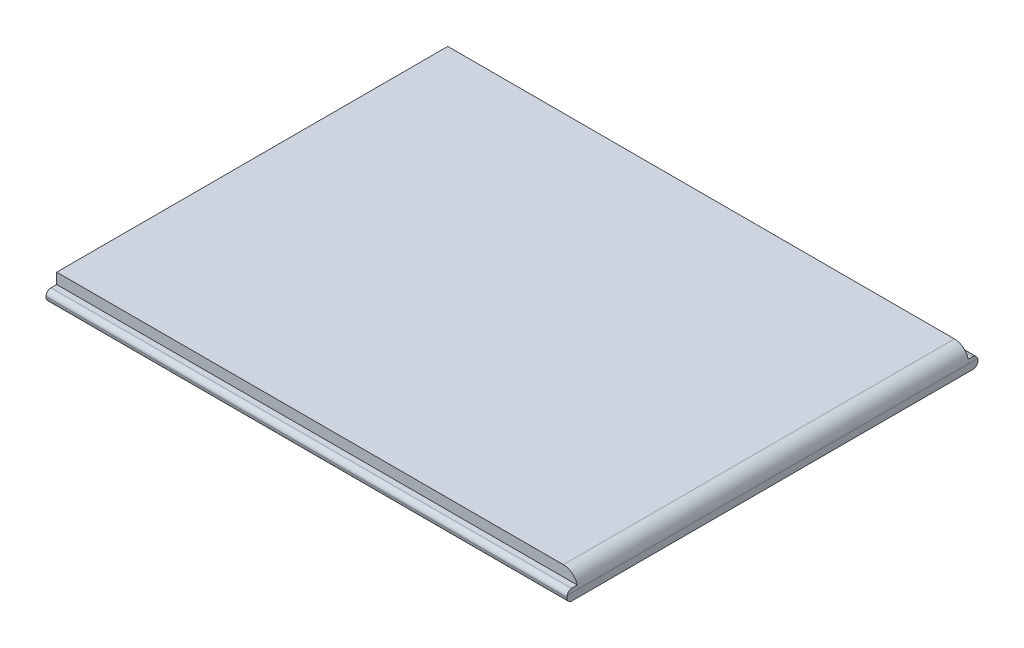
ISO-10303-21;
HEADER;
FILE_DESCRIPTION(('STEP AP214'),'2;1');
FILE_NAME('part.step','',(''),(''),'','','');
FILE_SCHEMA(('AUTOMOTIVE_DESIGN { 1 0 10303 214 1 1 1 1 }'));
ENDSEC;
DATA;
#1=APPLICATION_CONTEXT('core data for automotive mechanical design processes');
#2=APPLICATION_PROTOCOL_DEFINITION('international standard','automotive_design',2000,#1);
#3=PRODUCT_CONTEXT('',#1,'mechanical');
#4=PRODUCT('Part','Part','',(#3));
#5=PRODUCT_RELATED_PRODUCT_CATEGORY('part','',(#4));
#6=PRODUCT_DEFINITION_FORMATION('','',#4);
#7=PRODUCT_DEFINITION_CONTEXT('part definition',#1,'design');
#8=PRODUCT_DEFINITION('design','',#6,#7);
#9=PRODUCT_DEFINITION_SHAPE('','',#8);
#10=(LENGTH_UNIT() NAMED_UNIT(*) SI_UNIT(.MILLI.,.METRE.));
#11=(NAMED_UNIT(*) PLANE_ANGLE_UNIT() SI_UNIT($,.RADIAN.));
#12=(NAMED_UNIT(*) SI_UNIT($,.STERADIAN.) SOLID_ANGLE_UNIT());
#13=UNCERTAINTY_MEASURE_WITH_UNIT(LENGTH_MEASURE(1.E-05),#10,'distance_accuracy_value','');
#14=(GEOMETRIC_REPRESENTATION_CONTEXT(3) GLOBAL_UNCERTAINTY_ASSIGNED_CONTEXT((#13)) GLOBAL_UNIT_ASSIGNED_CONTEXT((#10,
#11,#12)) REPRESENTATION_CONTEXT('',''));
#15=CARTESIAN_POINT('',(0.,0.,0.));
#16=DIRECTION('',(0.,0.,1.));
#17=DIRECTION('',(1.,0.,0.));
#18=AXIS2_PLACEMENT_3D('',#15,#16,#17);
#19=CARTESIAN_POINT('',(0.,1.5,0.));
#20=DIRECTION('',(0.,-1.,0.));
#21=DIRECTION('',(0.,0.,-1.));
#22=AXIS2_PLACEMENT_3D('',#19,#20,#21);
#23=PLANE('',#22);
#24=DIRECTION('',(0.,0.,1.));
#25=VECTOR('',#24,1.);
#26=CARTESIAN_POINT('',(0.,1.5,0.));
#27=LINE('',#26,#25);
#28=CARTESIAN_POINT('',(0.,1.5,-1.5));
#29=VERTEX_POINT('',#28);
#30=CARTESIAN_POINT('',(0.,1.5,-0.7));
#31=VERTEX_POINT('',#30);
#32=EDGE_CURVE('E145',#29,#31,#27,.T.);
#33=ORIENTED_EDGE('',*,*,#32,.T.);
#34=DIRECTION('',(1.,0.,0.));
#35=VECTOR('',#34,1.);
#36=CARTESIAN_POINT('',(0.,1.5,-0.7));
#37=LINE('',#36,#35);
#38=CARTESIAN_POINT('',(72.9364916731037,1.5,-0.7));
#39=VERTEX_POINT('',#38);
#40=EDGE_CURVE('E217',#31,#39,#37,.T.);
#41=ORIENTED_EDGE('',*,*,#40,.T.);
#42=DIRECTION('',(0.,0.,1.));
#43=VECTOR('',#42,1.);
#44=CARTESIAN_POINT('',(72.9364916731037,1.5,0.));
#45=LINE('',#44,#43);
#46=CARTESIAN_POINT('',(72.9364916731037,1.5,-1.5));
#47=VERTEX_POINT('',#46);
#48=EDGE_CURVE('E198',#39,#47,#45,.F.);
#49=ORIENTED_EDGE('',*,*,#48,.T.);
#50=DIRECTION('',(1.,0.,0.));
#51=VECTOR('',#50,1.);
#52=CARTESIAN_POINT('',(0.,1.5,-1.5));
#53=LINE('',#52,#51);
#54=EDGE_CURVE('E166',#29,#47,#53,.T.);
#55=ORIENTED_EDGE('',*,*,#54,.F.);
#56=EDGE_LOOP('',(#33,#41,#49,#55));
#57=FACE_BOUND('',#56,.T.);
#58=ADVANCED_FACE('F35',(#57),#23,.F.);
#59=CARTESIAN_POINT('',(0.,1.5,0.));
#60=DIRECTION('',(1.,0.,0.));
#61=DIRECTION('',(0.,0.,-1.));
#62=AXIS2_PLACEMENT_3D('',#59,#60,#61);
#63=PLANE('',#62);
#64=DIRECTION('',(0.,-1.,0.));
#65=VECTOR('',#64,1.);
#66=CARTESIAN_POINT('',(0.,1.5,-57.6));
#67=LINE('',#66,#65);
#68=CARTESIAN_POINT('',(0.,0.8,-57.6));
#69=VERTEX_POINT('',#68);
#70=CARTESIAN_POINT('',(0.,0.7,-57.6));
#71=VERTEX_POINT('',#70);
#72=EDGE_CURVE('E175',#69,#71,#67,.T.);
#73=ORIENTED_EDGE('',*,*,#72,.T.);
#74=CARTESIAN_POINT('',(0.,0.7,-56.9));
#75=DIRECTION('',(1.,0.,0.));
#76=DIRECTION('',(0.,0.,-1.));
#77=AXIS2_PLACEMENT_3D('',#74,#75,#76);
#78=CIRCLE('',#77,0.7);
#79=CARTESIAN_POINT('',(0.,0.,-56.9));
#80=VERTEX_POINT('',#79);
#81=EDGE_CURVE('E282',#71,#80,#78,.F.);
#82=ORIENTED_EDGE('',*,*,#81,.T.);
#83=DIRECTION('',(0.,0.,1.));
#84=VECTOR('',#83,1.);
#85=CARTESIAN_POINT('',(0.,0.,0.));
#86=LINE('',#85,#84);
#87=CARTESIAN_POINT('',(0.,0.,-0.7));
#88=VERTEX_POINT('',#87);
#89=EDGE_CURVE('E172',#80,#88,#86,.T.);
#90=ORIENTED_EDGE('',*,*,#89,.T.);
#91=CARTESIAN_POINT('',(0.,0.7,-0.7));
#92=DIRECTION('',(1.,0.,0.));
#93=DIRECTION('',(0.,0.,-1.));
#94=AXIS2_PLACEMENT_3D('',#91,#92,#93);
#95=CIRCLE('',#94,0.7);
#96=CARTESIAN_POINT('',(0.,0.7,0.));
#97=VERTEX_POINT('',#96);
#98=EDGE_CURVE('E215',#88,#97,#95,.F.);
#99=ORIENTED_EDGE('',*,*,#98,.T.);
#100=DIRECTION('',(0.,-1.,0.));
#101=VECTOR('',#100,1.);
#102=CARTESIAN_POINT('',(0.,1.5,0.));
#103=LINE('',#102,#101);
#104=CARTESIAN_POINT('',(0.,0.8,0.));
#105=VERTEX_POINT('',#104);
#106=EDGE_CURVE('E187',#105,#97,#103,.T.);
#107=ORIENTED_EDGE('',*,*,#106,.F.);
#108=CARTESIAN_POINT('',(0.,0.8,-0.7));
#109=DIRECTION('',(1.,0.,0.));
#110=DIRECTION('',(0.,0.,-1.));
#111=AXIS2_PLACEMENT_3D('',#108,#109,#110);
#112=CIRCLE('',#111,0.7);
#113=EDGE_CURVE('E213',#105,#31,#112,.F.);
#114=ORIENTED_EDGE('',*,*,#113,.T.);
#115=ORIENTED_EDGE('',*,*,#32,.F.);
#116=DIRECTION('',(0.,-1.,0.));
#117=VECTOR('',#116,1.);
#118=CARTESIAN_POINT('',(0.,3.,-1.5));
#119=LINE('',#118,#117);
#120=CARTESIAN_POINT('',(0.,3.,-1.5));
#121=VERTEX_POINT('',#120);
#122=EDGE_CURVE('E137',#121,#29,#119,.T.);
#123=ORIENTED_EDGE('',*,*,#122,.F.);
#124=DIRECTION('',(0.,0.,-1.));
#125=VECTOR('',#124,1.);
#126=CARTESIAN_POINT('',(0.,3.,-1.5));
#127=LINE('',#126,#125);
#128=CARTESIAN_POINT('',(0.,3.,-56.3));
#129=VERTEX_POINT('',#128);
#130=EDGE_CURVE('E143',#121,#129,#127,.T.);
#131=ORIENTED_EDGE('',*,*,#130,.T.);
#132=DIRECTION('',(0.,-1.,0.));
#133=VECTOR('',#132,1.);
#134=CARTESIAN_POINT('',(0.,3.,-56.3));
#135=LINE('',#134,#133);
#136=CARTESIAN_POINT('',(0.,1.5,-56.3));
#137=VERTEX_POINT('',#136);
#138=EDGE_CURVE('E148',#129,#137,#135,.T.);
#139=ORIENTED_EDGE('',*,*,#138,.T.);
#140=CARTESIAN_POINT('',(0.,1.5,-56.9));
#141=VERTEX_POINT('',#140);
#142=EDGE_CURVE('E173',#141,#137,#27,.T.);
#143=ORIENTED_EDGE('',*,*,#142,.F.);
#144=CARTESIAN_POINT('',(0.,0.8,-56.9));
#145=DIRECTION('',(1.,0.,0.));
#146=DIRECTION('',(0.,0.,-1.));
#147=AXIS2_PLACEMENT_3D('',#144,#145,#146);
#148=CIRCLE('',#147,0.7);
#149=EDGE_CURVE('E275',#141,#69,#148,.F.);
#150=ORIENTED_EDGE('',*,*,#149,.T.);
#151=EDGE_LOOP('',(#73,#82,#90,#99,#107,#114,#115,#123,#131,#139,#143,#150));
#152=FACE_BOUND('',#151,.T.);
#153=ADVANCED_FACE('F140',(#152),#63,.F.);
#154=CARTESIAN_POINT('',(0.,1.5,0.));
#155=DIRECTION('',(0.,0.,-1.));
#156=DIRECTION('',(-1.,0.,0.));
#157=AXIS2_PLACEMENT_3D('',#154,#155,#156);
#158=PLANE('',#157);
#159=ORIENTED_EDGE('',*,*,#106,.T.);
#160=DIRECTION('',(1.,0.,0.));
#161=VECTOR('',#160,1.);
#162=CARTESIAN_POINT('',(73.,0.7,0.));
#163=LINE('',#162,#161);
#164=CARTESIAN_POINT('',(73.,0.7,0.));
#165=VERTEX_POINT('',#164);
#166=EDGE_CURVE('E203',#97,#165,#163,.T.);
#167=ORIENTED_EDGE('',*,*,#166,.T.);
#168=DIRECTION('',(0.,-1.,0.));
#169=VECTOR('',#168,1.);
#170=CARTESIAN_POINT('',(73.,1.5,0.));
#171=LINE('',#170,#169);
#172=CARTESIAN_POINT('',(73.,0.8,0.));
#173=VERTEX_POINT('',#172);
#174=EDGE_CURVE('E184',#173,#165,#171,.T.);
#175=ORIENTED_EDGE('',*,*,#174,.F.);
#176=DIRECTION('',(1.,0.,0.));
#177=VECTOR('',#176,1.);
#178=CARTESIAN_POINT('',(0.,0.8,0.));
#179=LINE('',#178,#177);
#180=EDGE_CURVE('E201',#173,#105,#179,.F.);
#181=ORIENTED_EDGE('',*,*,#180,.T.);
#182=EDGE_LOOP('',(#159,#167,#175,#181));
#183=FACE_BOUND('',#182,.T.);
#184=ADVANCED_FACE('F254',(#183),#158,.F.);
#185=CARTESIAN_POINT('',(73.,1.5,0.));
#186=DIRECTION('',(-1.,0.,0.));
#187=DIRECTION('',(0.,0.,1.));
#188=AXIS2_PLACEMENT_3D('',#185,#186,#187);
#189=PLANE('',#188);
#190=DIRECTION('',(0.,0.,-1.));
#191=VECTOR('',#190,1.);
#192=CARTESIAN_POINT('',(73.,0.,0.));
#193=LINE('',#192,#191);
#194=CARTESIAN_POINT('',(73.,0.,-0.7));
#195=VERTEX_POINT('',#194);
#196=CARTESIAN_POINT('',(73.,0.,-56.9));
#197=VERTEX_POINT('',#196);
#198=EDGE_CURVE('E177',#195,#197,#193,.T.);
#199=ORIENTED_EDGE('',*,*,#198,.T.);
#200=CARTESIAN_POINT('',(73.,0.7,-56.9));
#201=DIRECTION('',(-1.,0.,0.));
#202=DIRECTION('',(0.,0.,1.));
#203=AXIS2_PLACEMENT_3D('',#200,#201,#202);
#204=CIRCLE('',#203,0.7);
#205=CARTESIAN_POINT('',(73.,0.7,-57.6));
#206=VERTEX_POINT('',#205);
#207=EDGE_CURVE('E276',#197,#206,#204,.F.);
#208=ORIENTED_EDGE('',*,*,#207,.T.);
#209=DIRECTION('',(0.,-1.,0.));
#210=VECTOR('',#209,1.);
#211=CARTESIAN_POINT('',(73.,1.5,-57.6));
#212=LINE('',#211,#210);
#213=CARTESIAN_POINT('',(73.,0.8,-57.6));
#214=VERTEX_POINT('',#213);
#215=EDGE_CURVE('E181',#214,#206,#212,.T.);
#216=ORIENTED_EDGE('',*,*,#215,.F.);
#217=CARTESIAN_POINT('',(73.,0.8,-56.9));
#218=DIRECTION('',(-1.,0.,0.));
#219=DIRECTION('',(0.,0.,1.));
#220=AXIS2_PLACEMENT_3D('',#217,#218,#219);
#221=CIRCLE('',#220,0.7);
#222=CARTESIAN_POINT('',(73.,1.,-57.5708203932499));
#223=VERTEX_POINT('',#222);
#224=EDGE_CURVE('E62',#214,#223,#221,.F.);
#225=ORIENTED_EDGE('',*,*,#224,.T.);
#226=DIRECTION('',(0.,0.,-1.));
#227=VECTOR('',#226,1.);
#228=CARTESIAN_POINT('',(73.,1.,-1.5));
#229=LINE('',#228,#227);
#230=CARTESIAN_POINT('',(73.,1.,-0.0291796067500631));
#231=VERTEX_POINT('',#230);
#232=EDGE_CURVE('E196',#223,#231,#229,.F.);
#233=ORIENTED_EDGE('',*,*,#232,.T.);
#234=CARTESIAN_POINT('',(73.,0.8,-0.7));
#235=DIRECTION('',(-1.,0.,0.));
#236=DIRECTION('',(0.,0.,1.));
#237=AXIS2_PLACEMENT_3D('',#234,#235,#236);
#238=CIRCLE('',#237,0.7);
#239=EDGE_CURVE('E206',#231,#173,#238,.F.);
#240=ORIENTED_EDGE('',*,*,#239,.T.);
#241=ORIENTED_EDGE('',*,*,#174,.T.);
#242=CARTESIAN_POINT('',(73.,0.7,-0.7));
#243=DIRECTION('',(-1.,0.,0.));
#244=DIRECTION('',(0.,0.,1.));
#245=AXIS2_PLACEMENT_3D('',#242,#243,#244);
#246=CIRCLE('',#245,0.7);
#247=EDGE_CURVE('E208',#165,#195,#246,.F.);
#248=ORIENTED_EDGE('',*,*,#247,.T.);
#249=EDGE_LOOP('',(#199,#208,#216,#225,#233,#240,#241,#248));
#250=FACE_BOUND('',#249,.T.);
#251=ADVANCED_FACE('F267',(#250),#189,.F.);
#252=CARTESIAN_POINT('',(0.,1.5,-57.6));
#253=DIRECTION('',(0.,0.,1.));
#254=DIRECTION('',(1.,0.,0.));
#255=AXIS2_PLACEMENT_3D('',#252,#253,#254);
#256=PLANE('',#255);
#257=ORIENTED_EDGE('',*,*,#215,.T.);
#258=DIRECTION('',(-1.,0.,0.));
#259=VECTOR('',#258,1.);
#260=CARTESIAN_POINT('',(0.,0.7,-57.6));
#261=LINE('',#260,#259);
#262=EDGE_CURVE('E284',#206,#71,#261,.T.);
#263=ORIENTED_EDGE('',*,*,#262,.T.);
#264=ORIENTED_EDGE('',*,*,#72,.F.);
#265=DIRECTION('',(-1.,0.,0.));
#266=VECTOR('',#265,1.);
#267=CARTESIAN_POINT('',(0.,0.8,-57.6));
#268=LINE('',#267,#266);
#269=EDGE_CURVE('E228',#69,#214,#268,.F.);
#270=ORIENTED_EDGE('',*,*,#269,.T.);
#271=EDGE_LOOP('',(#257,#263,#264,#270));
#272=FACE_BOUND('',#271,.T.);
#273=ADVANCED_FACE('F259',(#272),#256,.F.);
#274=DIRECTION('',(0.,0.,1.));
#275=VECTOR('',#274,1.);
#276=CARTESIAN_POINT('',(72.9364916731037,1.5,-56.3));
#277=LINE('',#276,#275);
#278=CARTESIAN_POINT('',(72.9364916731037,1.5,-56.3));
#279=VERTEX_POINT('',#278);
#280=CARTESIAN_POINT('',(72.9364916731037,1.5,-56.9));
#281=VERTEX_POINT('',#280);
#282=EDGE_CURVE('E194',#279,#281,#277,.F.);
#283=ORIENTED_EDGE('',*,*,#282,.T.);
#284=DIRECTION('',(-1.,0.,0.));
#285=VECTOR('',#284,1.);
#286=CARTESIAN_POINT('',(0.,1.5,-56.9));
#287=LINE('',#286,#285);
#288=EDGE_CURVE('E49',#281,#141,#287,.T.);
#289=ORIENTED_EDGE('',*,*,#288,.T.);
#290=ORIENTED_EDGE('',*,*,#142,.T.);
#291=DIRECTION('',(1.,0.,0.));
#292=VECTOR('',#291,1.);
#293=CARTESIAN_POINT('',(0.,1.5,-56.3));
#294=LINE('',#293,#292);
#295=EDGE_CURVE('E169',#137,#279,#294,.T.);
#296=ORIENTED_EDGE('',*,*,#295,.T.);
#297=EDGE_LOOP('',(#283,#289,#290,#296));
#298=FACE_BOUND('',#297,.T.);
#299=ADVANCED_FACE('F250',(#298),#23,.F.);
#300=CARTESIAN_POINT('',(0.,0.,0.));
#301=DIRECTION('',(0.,-1.,0.));
#302=DIRECTION('',(0.,0.,-1.));
#303=AXIS2_PLACEMENT_3D('',#300,#301,#302);
#304=PLANE('',#303);
#305=ORIENTED_EDGE('',*,*,#89,.F.);
#306=DIRECTION('',(-1.,0.,0.));
#307=VECTOR('',#306,1.);
#308=CARTESIAN_POINT('',(73.,0.,-56.9));
#309=LINE('',#308,#307);
#310=EDGE_CURVE('E280',#80,#197,#309,.F.);
#311=ORIENTED_EDGE('',*,*,#310,.T.);
#312=ORIENTED_EDGE('',*,*,#198,.F.);
#313=DIRECTION('',(1.,0.,0.));
#314=VECTOR('',#313,1.);
#315=CARTESIAN_POINT('',(0.,0.,-0.7));
#316=LINE('',#315,#314);
#317=EDGE_CURVE('E210',#195,#88,#316,.F.);
#318=ORIENTED_EDGE('',*,*,#317,.T.);
#319=EDGE_LOOP('',(#305,#311,#312,#318));
#320=FACE_BOUND('',#319,.T.);
#321=ADVANCED_FACE('F258',(#320),#304,.T.);
#322=CARTESIAN_POINT('',(0.,3.,-56.3));
#323=DIRECTION('',(0.,0.,-1.));
#324=DIRECTION('',(-1.,0.,0.));
#325=AXIS2_PLACEMENT_3D('',#322,#323,#324);
#326=PLANE('',#325);
#327=DIRECTION('',(1.,0.,0.));
#328=VECTOR('',#327,1.);
#329=CARTESIAN_POINT('',(0.,3.,-56.3));
#330=LINE('',#329,#328);
#331=CARTESIAN_POINT('',(71.,3.,-56.3));
#332=VERTEX_POINT('',#331);
#333=EDGE_CURVE('E158',#129,#332,#330,.T.);
#334=ORIENTED_EDGE('',*,*,#333,.T.);
#335=CARTESIAN_POINT('',(71.,1.,-56.3));
#336=DIRECTION('',(0.,0.,-1.));
#337=DIRECTION('',(-1.,0.,0.));
#338=AXIS2_PLACEMENT_3D('',#335,#336,#337);
#339=CIRCLE('',#338,2.);
#340=EDGE_CURVE('E192',#332,#279,#339,.T.);
#341=ORIENTED_EDGE('',*,*,#340,.T.);
#342=ORIENTED_EDGE('',*,*,#295,.F.);
#343=ORIENTED_EDGE('',*,*,#138,.F.);
#344=EDGE_LOOP('',(#334,#341,#342,#343));
#345=FACE_BOUND('',#344,.T.);
#346=ADVANCED_FACE('F265',(#345),#326,.T.);
#347=CARTESIAN_POINT('',(0.,3.,-1.5));
#348=DIRECTION('',(0.,0.,-1.));
#349=DIRECTION('',(-1.,0.,0.));
#350=AXIS2_PLACEMENT_3D('',#347,#348,#349);
#351=PLANE('',#350);
#352=ORIENTED_EDGE('',*,*,#54,.T.);
#353=CARTESIAN_POINT('',(71.,1.,-1.5));
#354=DIRECTION('',(0.,0.,-1.));
#355=DIRECTION('',(-1.,0.,0.));
#356=AXIS2_PLACEMENT_3D('',#353,#354,#355);
#357=CIRCLE('',#356,2.);
#358=CARTESIAN_POINT('',(71.,3.,-1.5));
#359=VERTEX_POINT('',#358);
#360=EDGE_CURVE('E154',#47,#359,#357,.F.);
#361=ORIENTED_EDGE('',*,*,#360,.T.);
#362=DIRECTION('',(1.,0.,0.));
#363=VECTOR('',#362,1.);
#364=CARTESIAN_POINT('',(0.,3.,-1.5));
#365=LINE('',#364,#363);
#366=EDGE_CURVE('E151',#121,#359,#365,.T.);
#367=ORIENTED_EDGE('',*,*,#366,.F.);
#368=ORIENTED_EDGE('',*,*,#122,.T.);
#369=EDGE_LOOP('',(#352,#361,#367,#368));
#370=FACE_BOUND('',#369,.T.);
#371=ADVANCED_FACE('F152',(#370),#351,.F.);
#372=CARTESIAN_POINT('',(0.,3.,0.));
#373=DIRECTION('',(0.,1.,0.));
#374=DIRECTION('',(0.,0.,1.));
#375=AXIS2_PLACEMENT_3D('',#372,#373,#374);
#376=PLANE('',#375);
#377=ORIENTED_EDGE('',*,*,#366,.T.);
#378=DIRECTION('',(0.,0.,-1.));
#379=VECTOR('',#378,1.);
#380=CARTESIAN_POINT('',(71.,3.,-56.3));
#381=LINE('',#380,#379);
#382=EDGE_CURVE('E190',#359,#332,#381,.T.);
#383=ORIENTED_EDGE('',*,*,#382,.T.);
#384=ORIENTED_EDGE('',*,*,#333,.F.);
#385=ORIENTED_EDGE('',*,*,#130,.F.);
#386=EDGE_LOOP('',(#377,#383,#384,#385));
#387=FACE_BOUND('',#386,.T.);
#388=ADVANCED_FACE('F161',(#387),#376,.T.);
#389=CARTESIAN_POINT('',(71.,1.,0.));
#390=DIRECTION('',(0.,0.,1.));
#391=DIRECTION('',(1.,0.,0.));
#392=AXIS2_PLACEMENT_3D('',#389,#390,#391);
#393=CYLINDRICAL_SURFACE('',#392,2.);
#394=ORIENTED_EDGE('',*,*,#232,.F.);
#395=CARTESIAN_POINT('',(73.,1.,-57.5708203932499));
#396=CARTESIAN_POINT('',(73.000027382469,1.03716330865739,-57.5597764431058));
#397=CARTESIAN_POINT('',(72.9989646102049,1.07334916997243,-57.545593585722));
#398=CARTESIAN_POINT('',(72.9951931402886,1.1427619269264,-57.5115488800793));
#399=CARTESIAN_POINT('',(72.9924879029058,1.1759948753495,-57.4916990172545));
#400=CARTESIAN_POINT('',(72.9859635465852,1.23864237807867,-57.4468817398904));
#401=CARTESIAN_POINT('',(72.9821451111792,1.26805925957785,-57.4219174685156));
#402=CARTESIAN_POINT('',(72.9740370268929,1.32238370334598,-57.3675383096223));
#403=CARTESIAN_POINT('',(72.969747191275,1.34728946818667,-57.33812165661));
#404=CARTESIAN_POINT('',(72.9612418184612,1.39252528222939,-57.2747887318971));
#405=CARTESIAN_POINT('',(72.9570309562948,1.41272263620139,-57.2407769407444));
#406=CARTESIAN_POINT('',(72.9494572497008,1.44713194229693,-57.1697690788306));
#407=CARTESIAN_POINT('',(72.9460940147445,1.46134665284429,-57.1327743927923));
#408=CARTESIAN_POINT('',(72.9412011261283,1.4814885872002,-57.0632538636898));
#409=CARTESIAN_POINT('',(72.939457798382,1.48840969126614,-57.0310277363664));
#410=CARTESIAN_POINT('',(72.9370919407533,1.49767453847074,-56.9658745549445));
#411=CARTESIAN_POINT('',(72.9364697865245,1.50001674745449,-56.9329472696576));
#412=CARTESIAN_POINT('',(72.9364916731037,1.5,-56.9));
#413=B_SPLINE_CURVE_WITH_KNOTS('',3,(#395,#396,#397,#398,#399,#400,#401,#402,#403,#404,#405,
#406,#407,#408,#409,#410,#411,#412),.UNSPECIFIED.,.F.,.F.,(4,2,2,2,2,2,2,2,4),(0.,
0.116098805181456,0.231953863427992,0.347737933025797,0.463568035113821,0.582348228082574,
0.701073594784606,0.799758851333485,0.898477166630464),.UNSPECIFIED.);
#414=EDGE_CURVE('E11',#223,#281,#413,.T.);
#415=ORIENTED_EDGE('',*,*,#414,.T.);
#416=ORIENTED_EDGE('',*,*,#282,.F.);
#417=ORIENTED_EDGE('',*,*,#340,.F.);
#418=ORIENTED_EDGE('',*,*,#382,.F.);
#419=ORIENTED_EDGE('',*,*,#360,.F.);
#420=ORIENTED_EDGE('',*,*,#48,.F.);
#421=CARTESIAN_POINT('',(72.9364916731037,1.5,-0.7));
#422=CARTESIAN_POINT('',(72.9364492324393,1.50003581820018,-0.661190698375178));
#423=CARTESIAN_POINT('',(72.9373241249352,1.49677503922478,-0.622408245457301));
#424=CARTESIAN_POINT('',(72.9405863386522,1.4839442372977,-0.546044044428776));
#425=CARTESIAN_POINT('',(72.9429705768953,1.47438707367734,-0.508460012415939));
#426=CARTESIAN_POINT('',(72.9489309607013,1.44924836676181,-0.435481637324123));
#427=CARTESIAN_POINT('',(72.952506821972,1.43366826025261,-0.400086774348321));
#428=CARTESIAN_POINT('',(72.9603039511576,1.39694107580762,-0.332379959085985));
#429=CARTESIAN_POINT('',(72.9645254710306,1.37579182226556,-0.30006921835802));
#430=CARTESIAN_POINT('',(72.9730750710552,1.32798522118777,-0.238724131766238));
#431=CARTESIAN_POINT('',(72.97740353853,1.30122227265173,-0.209772096269619));
#432=CARTESIAN_POINT('',(72.9853776530153,1.24317210138616,-0.156729346701311));
#433=CARTESIAN_POINT('',(72.9890236438794,1.21188717113294,-0.132636184098118));
#434=CARTESIAN_POINT('',(72.9944720328723,1.15114797171535,-0.0935577269005131));
#435=CARTESIAN_POINT('',(72.9964802242369,1.12225496159968,-0.0777240442293924));
#436=CARTESIAN_POINT('',(72.999251834991,1.06247548046967,-0.0502341653734089));
#437=CARTESIAN_POINT('',(73.0000146404364,1.03158803404298,-0.0385800318091156));
#438=CARTESIAN_POINT('',(73.,1.,-0.0291796067500633));
#439=B_SPLINE_CURVE_WITH_KNOTS('',3,(#421,#422,#423,#424,#425,#426,#427,#428,#429,#430,#431,
#432,#433,#434,#435,#436,#437,#438),.UNSPECIFIED.,.F.,.F.,(4,2,2,2,2,2,2,2,4),(0.,
0.116239994979503,0.232243321767967,0.348218992772942,0.464240037456085,0.582678899541239,
0.70105792677257,0.79974373559907,0.898478179380812),.UNSPECIFIED.);
#440=EDGE_CURVE('E220',#39,#231,#439,.T.);
#441=ORIENTED_EDGE('',*,*,#440,.T.);
#442=EDGE_LOOP('',(#394,#415,#416,#417,#418,#419,#420,#441));
#443=FACE_BOUND('',#442,.T.);
#444=ADVANCED_FACE('F230',(#443),#393,.T.);
#445=CARTESIAN_POINT('',(0.,0.7,-0.7));
#446=DIRECTION('',(-1.,0.,0.));
#447=DIRECTION('',(0.,0.,1.));
#448=AXIS2_PLACEMENT_3D('',#445,#446,#447);
#449=CYLINDRICAL_SURFACE('',#448,0.7);
#450=ORIENTED_EDGE('',*,*,#98,.F.);
#451=ORIENTED_EDGE('',*,*,#317,.F.);
#452=ORIENTED_EDGE('',*,*,#247,.F.);
#453=ORIENTED_EDGE('',*,*,#166,.F.);
#454=EDGE_LOOP('',(#450,#451,#452,#453));
#455=FACE_BOUND('',#454,.T.);
#456=ADVANCED_FACE('F238',(#455),#449,.T.);
#457=CARTESIAN_POINT('',(0.,0.8,-0.7));
#458=DIRECTION('',(1.,0.,0.));
#459=DIRECTION('',(0.,0.,-1.));
#460=AXIS2_PLACEMENT_3D('',#457,#458,#459);
#461=CYLINDRICAL_SURFACE('',#460,0.7);
#462=ORIENTED_EDGE('',*,*,#113,.F.);
#463=ORIENTED_EDGE('',*,*,#180,.F.);
#464=ORIENTED_EDGE('',*,*,#239,.F.);
#465=ORIENTED_EDGE('',*,*,#440,.F.);
#466=ORIENTED_EDGE('',*,*,#40,.F.);
#467=EDGE_LOOP('',(#462,#463,#464,#465,#466));
#468=FACE_BOUND('',#467,.T.);
#469=ADVANCED_FACE('F234',(#468),#461,.T.);
#470=CARTESIAN_POINT('',(0.,0.7,-56.9));
#471=DIRECTION('',(1.,0.,0.));
#472=DIRECTION('',(0.,0.,-1.));
#473=AXIS2_PLACEMENT_3D('',#470,#471,#472);
#474=CYLINDRICAL_SURFACE('',#473,0.7);
#475=ORIENTED_EDGE('',*,*,#207,.F.);
#476=ORIENTED_EDGE('',*,*,#310,.F.);
#477=ORIENTED_EDGE('',*,*,#81,.F.);
#478=ORIENTED_EDGE('',*,*,#262,.F.);
#479=EDGE_LOOP('',(#475,#476,#477,#478));
#480=FACE_BOUND('',#479,.T.);
#481=ADVANCED_FACE('F237',(#480),#474,.T.);
#482=CARTESIAN_POINT('',(0.,0.8,-56.9));
#483=DIRECTION('',(-1.,0.,0.));
#484=DIRECTION('',(0.,0.,1.));
#485=AXIS2_PLACEMENT_3D('',#482,#483,#484);
#486=CYLINDRICAL_SURFACE('',#485,0.7);
#487=ORIENTED_EDGE('',*,*,#224,.F.);
#488=ORIENTED_EDGE('',*,*,#269,.F.);
#489=ORIENTED_EDGE('',*,*,#149,.F.);
#490=ORIENTED_EDGE('',*,*,#288,.F.);
#491=ORIENTED_EDGE('',*,*,#414,.F.);
#492=EDGE_LOOP('',(#487,#488,#489,#490,#491));
#493=FACE_BOUND('',#492,.T.);
#494=ADVANCED_FACE('F37',(#493),#486,.T.);
#495=CLOSED_SHELL('',(#58,#153,#184,#251,#273,#299,#321,#346,#371,#388,#444,#456,#469,#481,#494));
#496=MANIFOLD_SOLID_BREP('B2',#495);
#497=ADVANCED_BREP_SHAPE_REPRESENTATION('',(#18,#496),#14);
#498=SHAPE_DEFINITION_REPRESENTATION(#9,#497);
ENDSEC;
END-ISO-10303-21;
